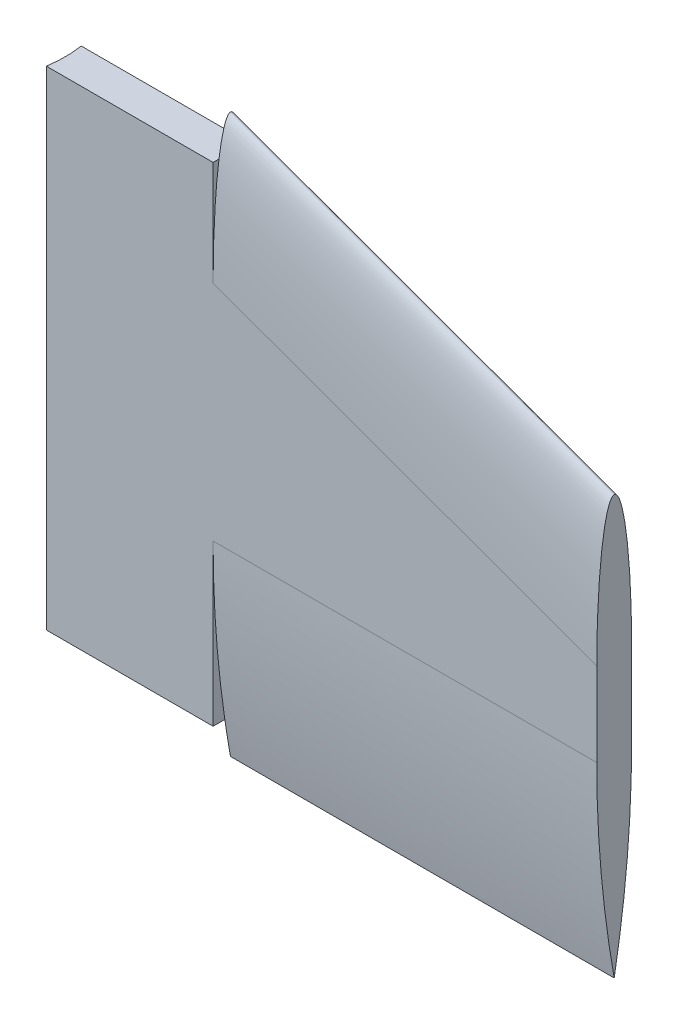
ISO-10303-21;
HEADER;
FILE_DESCRIPTION(('STEP AP214'),'2;1');
FILE_NAME('part.step','',(''),(''),'','','');
FILE_SCHEMA(('AUTOMOTIVE_DESIGN { 1 0 10303 214 1 1 1 1 }'));
ENDSEC;
DATA;
#1=APPLICATION_CONTEXT('core data for automotive mechanical design processes');
#2=APPLICATION_PROTOCOL_DEFINITION('international standard','automotive_design',2000,#1);
#3=PRODUCT_CONTEXT('',#1,'mechanical');
#4=PRODUCT('Part','Part','',(#3));
#5=PRODUCT_RELATED_PRODUCT_CATEGORY('part','',(#4));
#6=PRODUCT_DEFINITION_FORMATION('','',#4);
#7=PRODUCT_DEFINITION_CONTEXT('part definition',#1,'design');
#8=PRODUCT_DEFINITION('design','',#6,#7);
#9=PRODUCT_DEFINITION_SHAPE('','',#8);
#10=(LENGTH_UNIT() NAMED_UNIT(*) SI_UNIT(.MILLI.,.METRE.));
#11=(NAMED_UNIT(*) PLANE_ANGLE_UNIT() SI_UNIT($,.RADIAN.));
#12=(NAMED_UNIT(*) SI_UNIT($,.STERADIAN.) SOLID_ANGLE_UNIT());
#13=UNCERTAINTY_MEASURE_WITH_UNIT(LENGTH_MEASURE(1.E-05),#10,'distance_accuracy_value','');
#14=(GEOMETRIC_REPRESENTATION_CONTEXT(3) GLOBAL_UNCERTAINTY_ASSIGNED_CONTEXT((#13)) GLOBAL_UNIT_ASSIGNED_CONTEXT((#10,
#11,#12)) REPRESENTATION_CONTEXT('',''));
#15=CARTESIAN_POINT('',(0.,0.,0.));
#16=DIRECTION('',(0.,0.,1.));
#17=DIRECTION('',(1.,0.,0.));
#18=AXIS2_PLACEMENT_3D('',#15,#16,#17);
#19=CARTESIAN_POINT('',(80.,55.,5.));
#20=DIRECTION('',(-1.,0.,0.));
#21=DIRECTION('',(0.,-1.,0.));
#22=AXIS2_PLACEMENT_3D('',#19,#20,#21);
#23=PLANE('',#22);
#24=CARTESIAN_POINT('',(80.,23.,-153.05));
#25=DIRECTION('',(1.,0.,0.));
#26=DIRECTION('',(0.,1.,0.));
#27=AXIS2_PLACEMENT_3D('',#24,#25,#26);
#28=CIRCLE('',#27,158.05);
#29=CARTESIAN_POINT('',(80.,23.,5.));
#30=VERTEX_POINT('',#29);
#31=CARTESIAN_POINT('',(80.,-5.,2.5));
#32=VERTEX_POINT('',#31);
#33=EDGE_CURVE('E265',#30,#32,#28,.T.);
#34=ORIENTED_EDGE('',*,*,#33,.T.);
#35=CARTESIAN_POINT('',(80.,23.,158.05));
#36=DIRECTION('',(1.,0.,0.));
#37=DIRECTION('',(0.,1.,0.));
#38=AXIS2_PLACEMENT_3D('',#35,#36,#37);
#39=CIRCLE('',#38,158.05);
#40=CARTESIAN_POINT('',(80.,23.,0.));
#41=VERTEX_POINT('',#40);
#42=EDGE_CURVE('E161',#41,#32,#39,.F.);
#43=ORIENTED_EDGE('',*,*,#42,.F.);
#44=DIRECTION('',(0.,1.,0.));
#45=VECTOR('',#44,1.);
#46=CARTESIAN_POINT('',(80.,55.,0.));
#47=LINE('',#46,#45);
#48=CARTESIAN_POINT('',(80.,35.,0.));
#49=VERTEX_POINT('',#48);
#50=EDGE_CURVE('E170',#41,#49,#47,.T.);
#51=ORIENTED_EDGE('',*,*,#50,.T.);
#52=CARTESIAN_POINT('',(80.,35.,2.5));
#53=DIRECTION('',(1.,0.,0.));
#54=DIRECTION('',(0.,1.,0.));
#55=AXIS2_PLACEMENT_3D('',#52,#53,#54);
#56=ELLIPSE('',#55,20.,2.5);
#57=CARTESIAN_POINT('',(80.,35.,5.));
#58=VERTEX_POINT('',#57);
#59=EDGE_CURVE('E244',#49,#58,#56,.T.);
#60=ORIENTED_EDGE('',*,*,#59,.T.);
#61=DIRECTION('',(0.,1.,0.));
#62=VECTOR('',#61,1.);
#63=CARTESIAN_POINT('',(80.,55.,5.));
#64=LINE('',#63,#62);
#65=EDGE_CURVE('E174',#30,#58,#64,.T.);
#66=ORIENTED_EDGE('',*,*,#65,.F.);
#67=EDGE_LOOP('',(#34,#43,#51,#60,#66));
#68=FACE_BOUND('',#67,.T.);
#69=ADVANCED_FACE('F58',(#68),#23,.F.);
#70=CARTESIAN_POINT('',(25.,-5.,5.));
#71=DIRECTION('',(1.,0.,0.));
#72=DIRECTION('',(0.,1.,0.));
#73=AXIS2_PLACEMENT_3D('',#70,#71,#72);
#74=PLANE('',#73);
#75=DIRECTION('',(0.,0.,-1.));
#76=VECTOR('',#75,1.);
#77=CARTESIAN_POINT('',(25.,0.,5.));
#78=LINE('',#77,#76);
#79=CARTESIAN_POINT('',(25.,0.,3.31752380209902));
#80=VERTEX_POINT('',#79);
#81=CARTESIAN_POINT('',(25.,0.,1.68247619790099));
#82=VERTEX_POINT('',#81);
#83=EDGE_CURVE('E67',#80,#82,#78,.T.);
#84=ORIENTED_EDGE('',*,*,#83,.T.);
#85=CARTESIAN_POINT('',(25.,23.,158.05));
#86=DIRECTION('',(1.,0.,0.));
#87=DIRECTION('',(0.,1.,0.));
#88=AXIS2_PLACEMENT_3D('',#85,#86,#87);
#89=CIRCLE('',#88,158.05);
#90=CARTESIAN_POINT('',(24.9999999999996,-5.00000000000001,2.5));
#91=VERTEX_POINT('',#90);
#92=EDGE_CURVE('E275',#91,#82,#89,.T.);
#93=ORIENTED_EDGE('',*,*,#92,.F.);
#94=CARTESIAN_POINT('',(25.,23.,-153.05));
#95=DIRECTION('',(1.,0.,0.));
#96=DIRECTION('',(0.,1.,0.));
#97=AXIS2_PLACEMENT_3D('',#94,#95,#96);
#98=CIRCLE('',#97,158.05);
#99=EDGE_CURVE('E279',#91,#80,#98,.F.);
#100=ORIENTED_EDGE('',*,*,#99,.T.);
#101=EDGE_LOOP('',(#84,#93,#100));
#102=FACE_BOUND('',#101,.T.);
#103=ADVANCED_FACE('F295',(#102),#74,.F.);
#104=CARTESIAN_POINT('',(0.,0.,0.));
#105=DIRECTION('',(0.,0.,-1.));
#106=DIRECTION('',(-1.,0.,0.));
#107=AXIS2_PLACEMENT_3D('',#104,#105,#106);
#108=PLANE('',#107);
#109=DIRECTION('',(0.,1.,0.));
#110=VECTOR('',#109,1.);
#111=CARTESIAN_POINT('',(1.10222914111242,-5.,0.));
#112=LINE('',#111,#110);
#113=CARTESIAN_POINT('',(1.10222914111242,70.,0.));
#114=VERTEX_POINT('',#113);
#115=CARTESIAN_POINT('',(1.10222914111242,0.,0.));
#116=VERTEX_POINT('',#115);
#117=EDGE_CURVE('E143',#114,#116,#112,.F.);
#118=ORIENTED_EDGE('',*,*,#117,.F.);
#119=DIRECTION('',(-1.,0.,0.));
#120=VECTOR('',#119,1.);
#121=CARTESIAN_POINT('',(0.,70.,0.));
#122=LINE('',#121,#120);
#123=CARTESIAN_POINT('',(25.,70.,0.));
#124=VERTEX_POINT('',#123);
#125=EDGE_CURVE('E157',#124,#114,#122,.T.);
#126=ORIENTED_EDGE('',*,*,#125,.F.);
#127=DIRECTION('',(0.,-1.,0.));
#128=VECTOR('',#127,1.);
#129=CARTESIAN_POINT('',(24.9999999999999,27.1086884357356,0.));
#130=LINE('',#129,#128);
#131=CARTESIAN_POINT('',(25.,55.,0.));
#132=VERTEX_POINT('',#131);
#133=EDGE_CURVE('E235',#124,#132,#130,.T.);
#134=ORIENTED_EDGE('',*,*,#133,.T.);
#135=DIRECTION('',(0.939793423488437,-0.341743063086705,0.));
#136=VECTOR('',#135,1.);
#137=CARTESIAN_POINT('',(5.45110680172721,62.1086884357356,0.));
#138=LINE('',#137,#136);
#139=EDGE_CURVE('E236',#132,#49,#138,.T.);
#140=ORIENTED_EDGE('',*,*,#139,.T.);
#141=ORIENTED_EDGE('',*,*,#50,.F.);
#142=DIRECTION('',(1.,0.,0.));
#143=VECTOR('',#142,1.);
#144=CARTESIAN_POINT('',(-3.1113855937412,23.,0.));
#145=LINE('',#144,#143);
#146=CARTESIAN_POINT('',(25.,23.,0.));
#147=VERTEX_POINT('',#146);
#148=EDGE_CURVE('E421',#147,#41,#145,.T.);
#149=ORIENTED_EDGE('',*,*,#148,.F.);
#150=DIRECTION('',(0.,-1.,0.));
#151=VECTOR('',#150,1.);
#152=CARTESIAN_POINT('',(25.,0.,0.));
#153=LINE('',#152,#151);
#154=CARTESIAN_POINT('',(25.,0.,0.));
#155=VERTEX_POINT('',#154);
#156=EDGE_CURVE('E423',#147,#155,#153,.T.);
#157=ORIENTED_EDGE('',*,*,#156,.T.);
#158=DIRECTION('',(1.,0.,0.));
#159=VECTOR('',#158,1.);
#160=CARTESIAN_POINT('',(25.,0.,0.));
#161=LINE('',#160,#159);
#162=EDGE_CURVE('E159',#116,#155,#161,.T.);
#163=ORIENTED_EDGE('',*,*,#162,.F.);
#164=EDGE_LOOP('',(#118,#126,#134,#140,#141,#149,#157,#163));
#165=FACE_BOUND('',#164,.T.);
#166=ADVANCED_FACE('F155',(#165),#108,.T.);
#167=CARTESIAN_POINT('',(25.,70.,5.));
#168=DIRECTION('',(1.,0.,0.));
#169=DIRECTION('',(0.,1.,0.));
#170=AXIS2_PLACEMENT_3D('',#167,#168,#169);
#171=PLANE('',#170);
#172=CARTESIAN_POINT('',(25.,55.,5.));
#173=CARTESIAN_POINT('',(25.,55.5720004388794,4.99997488519982));
#174=CARTESIAN_POINT('',(25.,56.1440026961929,4.99693141602449));
#175=CARTESIAN_POINT('',(25.,57.2879536627687,4.98463095757736));
#176=CARTESIAN_POINT('',(25.,57.8599023704368,4.97537382074938));
#177=CARTESIAN_POINT('',(25.,59.0036644576572,4.95046914389847));
#178=CARTESIAN_POINT('',(25.,59.5754778365875,4.93482157505513));
#179=CARTESIAN_POINT('',(25.,60.718876444292,4.8967579252481));
#180=CARTESIAN_POINT('',(25.,61.2904616748311,4.87434189770684));
#181=CARTESIAN_POINT('',(25.,62.4333279929488,4.82216211654355));
#182=CARTESIAN_POINT('',(25.,63.0046090644194,4.79239800635157));
#183=CARTESIAN_POINT('',(25.,64.1466791661225,4.72464145556082));
#184=CARTESIAN_POINT('',(25.,64.7174682025077,4.68664911939574));
#185=CARTESIAN_POINT('',(25.,65.8584275394748,4.60111055722037));
#186=CARTESIAN_POINT('',(25.,66.4285977400708,4.55356296780029));
#187=CARTESIAN_POINT('',(25.,67.2830238536228,4.47346948162914));
#188=CARTESIAN_POINT('',(25.,67.5676927821684,4.44530981658055));
#189=CARTESIAN_POINT('',(25.,68.1366806467351,4.38566017037874));
#190=CARTESIAN_POINT('',(25.,68.4209995862596,4.35417022283987));
#191=CARTESIAN_POINT('',(25.,69.0618234563635,4.27880492355438));
#192=CARTESIAN_POINT('',(25.,69.4181992662102,4.23382139317496));
#193=CARTESIAN_POINT('',(25.,70.1299349019454,4.13633199524897));
#194=CARTESIAN_POINT('',(25.,70.485294742801,4.08382623910718));
#195=CARTESIAN_POINT('',(25.,71.079966111065,3.98738676032596));
#196=CARTESIAN_POINT('',(25.,71.3197146520282,3.94615594705027));
#197=CARTESIAN_POINT('',(25.,71.7981391093133,3.85788065785431));
#198=CARTESIAN_POINT('',(25.,72.0368151113112,3.81083665517478));
#199=CARTESIAN_POINT('',(25.,72.4363016405698,3.72523973527165));
#200=CARTESIAN_POINT('',(25.,72.597562391991,3.68879456718262));
#201=CARTESIAN_POINT('',(25.,72.9189981651543,3.61125273657672));
#202=CARTESIAN_POINT('',(25.,73.0791730823828,3.57015563285419));
#203=CARTESIAN_POINT('',(25.,73.3473629227435,3.49564855876825));
#204=CARTESIAN_POINT('',(25.,73.4558436171766,3.46392157541193));
#205=CARTESIAN_POINT('',(25.,73.671580658925,3.3966662266282));
#206=CARTESIAN_POINT('',(25.,73.7788375929399,3.36113977547955));
#207=CARTESIAN_POINT('',(25.,73.9584288067411,3.29674402046781));
#208=CARTESIAN_POINT('',(25.,74.0312493873934,3.26924081175468));
#209=CARTESIAN_POINT('',(25.,74.1756935186942,3.21099098100011));
#210=CARTESIAN_POINT('',(25.,74.2473155429742,3.18024054106987));
#211=CARTESIAN_POINT('',(25.,74.386176597405,3.11550565133564));
#212=CARTESIAN_POINT('',(25.,74.4534817890112,3.08166740579186));
#213=CARTESIAN_POINT('',(25.,74.5519053884584,3.02656378020559));
#214=CARTESIAN_POINT('',(25.,74.5842511685421,3.00749865373644));
#215=CARTESIAN_POINT('',(25.,74.6478256295048,2.96753460090541));
#216=CARTESIAN_POINT('',(25.,74.6790537975318,2.94663484747765));
#217=CARTESIAN_POINT('',(25.,74.7363257769538,2.90509397095348));
#218=CARTESIAN_POINT('',(25.,74.7625504448733,2.88470479128762));
#219=CARTESIAN_POINT('',(25.,74.8130750788164,2.84169326167559));
#220=CARTESIAN_POINT('',(25.,74.8373776803399,2.8190740686275));
#221=CARTESIAN_POINT('',(25.,74.8834528114579,2.770624493738));
#222=CARTESIAN_POINT('',(25.,74.9051780891119,2.74474811143269));
#223=CARTESIAN_POINT('',(25.,74.9436663388231,2.68951856317908));
#224=CARTESIAN_POINT('',(25.,74.9604529253396,2.66018291406145));
#225=CARTESIAN_POINT('',(25.,74.9817551484157,2.60870447367483));
#226=CARTESIAN_POINT('',(25.,74.9885022980104,2.58750611406828));
#227=CARTESIAN_POINT('',(25.,74.9976177941652,2.54420149170385));
#228=CARTESIAN_POINT('',(25.,74.999997694106,2.5220977830347));
#229=CARTESIAN_POINT('',(25.,75.0000020794715,2.48007206282373));
#230=CARTESIAN_POINT('',(25.,74.9980705662995,2.46014894470527));
#231=CARTESIAN_POINT('',(25.,74.9906222272486,2.42097290369096));
#232=CARTESIAN_POINT('',(25.,74.985099122873,2.40172121674289));
#233=CARTESIAN_POINT('',(25.,74.9690774229299,2.35895445753588));
#234=CARTESIAN_POINT('',(25.,74.9576029389327,2.33581237100939));
#235=CARTESIAN_POINT('',(25.,74.9311936192979,2.29161402067852));
#236=CARTESIAN_POINT('',(25.,74.9162512909001,2.2705624163366));
#237=CARTESIAN_POINT('',(25.,74.885292949687,2.23198707660667));
#238=CARTESIAN_POINT('',(25.,74.869456648164,2.21431593155002));
#239=CARTESIAN_POINT('',(25.,74.8363383138934,2.18037104962037));
#240=CARTESIAN_POINT('',(25.,74.8190549474168,2.16409863054509));
#241=CARTESIAN_POINT('',(25.,74.7833920798095,2.13271454405103));
#242=CARTESIAN_POINT('',(25.,74.7650097466571,2.11760612736233));
#243=CARTESIAN_POINT('',(25.,74.7274604629157,2.08842444650872));
#244=CARTESIAN_POINT('',(25.,74.7082938565375,2.07435073564678));
#245=CARTESIAN_POINT('',(25.,74.6554523949701,2.03734095975634));
#246=CARTESIAN_POINT('',(25.,74.6211868659335,2.01524941140818));
#247=CARTESIAN_POINT('',(25.,74.5514420908496,1.9730600143313));
#248=CARTESIAN_POINT('',(25.,74.5159621025146,1.95296341528778));
#249=CARTESIAN_POINT('',(25.,74.4081116333862,1.89498234461649));
#250=CARTESIAN_POINT('',(25.,74.3344586080401,1.85949070499232));
#251=CARTESIAN_POINT('',(25.,74.1849206859795,1.79272516176865));
#252=CARTESIAN_POINT('',(25.,74.1090271055556,1.76147133947762));
#253=CARTESIAN_POINT('',(25.,73.9560814934609,1.70226133138422));
#254=CARTESIAN_POINT('',(25.,73.8790310209192,1.67430109033174));
#255=CARTESIAN_POINT('',(25.,73.7097418409384,1.61595698386845));
#256=CARTESIAN_POINT('',(25.,73.6173296095386,1.58608123937837));
#257=CARTESIAN_POINT('',(25.,73.431660250649,1.52905988703803));
#258=CARTESIAN_POINT('',(25.,73.3384030048576,1.50191466810481));
#259=CARTESIAN_POINT('',(25.,73.1512033432352,1.44980621969121));
#260=CARTESIAN_POINT('',(25.,73.0572604358996,1.42484476586705));
#261=CARTESIAN_POINT('',(25.,72.8689058315822,1.37675177469865));
#262=CARTESIAN_POINT('',(25.,72.7744941143264,1.35362031723905));
#263=CARTESIAN_POINT('',(25.,72.491333736507,1.28668374573611));
#264=CARTESIAN_POINT('',(25.,72.3020432171087,1.24516932810004));
#265=CARTESIAN_POINT('',(25.,71.922594810639,1.16677471583677));
#266=CARTESIAN_POINT('',(25.,71.7324372744376,1.12989279382941));
#267=CARTESIAN_POINT('',(25.,71.352031468322,1.05991946495277));
#268=CARTESIAN_POINT('',(25.,71.1617852605057,1.02681679339588));
#269=CARTESIAN_POINT('',(25.,70.7807771762973,0.963634068583808));
#270=CARTESIAN_POINT('',(25.,70.5900152529589,0.933554300722833));
#271=CARTESIAN_POINT('',(25.,70.0170031948054,0.847114816925599));
#272=CARTESIAN_POINT('',(25.,69.6341750673416,0.79458135653289));
#273=CARTESIAN_POINT('',(25.,68.8676184858264,0.697285760413535));
#274=CARTESIAN_POINT('',(25.,68.4838901932427,0.652522325051148));
#275=CARTESIAN_POINT('',(25.,67.7157390510043,0.569293116986108));
#276=CARTESIAN_POINT('',(25.,67.3313161725483,0.53082761178575));
#277=CARTESIAN_POINT('',(25.,66.5620065337952,0.459206034539197));
#278=CARTESIAN_POINT('',(25.,66.1771198063282,0.426049606684746));
#279=CARTESIAN_POINT('',(25.,65.4069737301898,0.364350304300474));
#280=CARTESIAN_POINT('',(25.,65.0217143764718,0.335807493160882));
#281=CARTESIAN_POINT('',(25.,64.235704108839,0.281784251470453));
#282=CARTESIAN_POINT('',(25.,63.8349418790816,0.256469140801837));
#283=CARTESIAN_POINT('',(25.,63.0331824702211,0.209861020970679));
#284=CARTESIAN_POINT('',(25.,62.632185289196,0.188568045185991));
#285=CARTESIAN_POINT('',(25.,61.4289449335814,0.130233791579434));
#286=CARTESIAN_POINT('',(25.,60.6264293237784,0.0987356055028632));
#287=CARTESIAN_POINT('',(25.,59.0199991116043,0.0488384278155599));
#288=CARTESIAN_POINT('',(25.,58.2160840123997,0.0304558153104526));
#289=CARTESIAN_POINT('',(25.,57.0100971016644,0.0121447661575967));
#290=CARTESIAN_POINT('',(25.,56.6080906629853,0.00758489324828465));
#291=CARTESIAN_POINT('',(25.,55.80405657695,0.00151472190236802));
#292=CARTESIAN_POINT('',(25.,55.4020289297006,4.40933902144058E-06));
#293=CARTESIAN_POINT('',(25.,55.,0.));
#294=B_SPLINE_CURVE_WITH_KNOTS('',3,(#172,#173,#174,#175,#176,#177,#178,#179,#180,#181,#182,
#183,#184,#185,#186,#187,#188,#189,#190,#191,#192,#193,#194,#195,#196,#197,#198,#199,#200,#201,
#202,#203,#204,#205,#206,#207,#208,#209,#210,#211,#212,#213,#214,#215,#216,#217,#218,#219,#220,
#221,#222,#223,#224,#225,#226,#227,#228,#229,#230,#231,#232,#233,#234,#235,#236,#237,#238,#239,
#240,#241,#242,#243,#244,#245,#246,#247,#248,#249,#250,#251,#252,#253,#254,#255,#256,#257,#258,
#259,#260,#261,#262,#263,#264,#265,#266,#267,#268,#269,#270,#271,#272,#273,#274,#275,#276,#277,
#278,#279,#280,#281,#282,#283,#284,#285,#286,#287,#288,#289,#290,#291,#292,#293),.UNSPECIFIED.,
.F.,.F.,(4,2,2,2,2,2,2,2,2,2,2,2,2,2,2,2,2,2,2,2,2,2,2,2,2,2,2,2,2,2,2,2,2,2,2,2,2,2,2,2,2,2,2,
2,2,2,2,2,2,2,2,2,2,2,2,2,2,2,2,2,4),(0.,1.71599615077383,3.43203305280662,5.14807769412917,
6.86410879132182,8.58022317628934,10.2963157813946,12.0126534245768,12.8708127178165,
13.7289633500175,14.8065149463982,15.8840505858027,16.6138057869719,17.3435016192407,
17.8394387557629,18.3354229681512,18.6744504962385,19.0133080103136,19.2467739450679,
19.4805174966928,19.7062830459991,19.818878428791,19.9315248338326,20.0310866609772,
20.1305095146967,20.2315396252694,20.3320784999233,20.3984435996496,20.4646328787026,
20.5243228391227,20.5841174256887,20.6611680881807,20.7383868052756,20.8094685567982,
20.8806165596799,20.9519565524599,21.0232655636787,21.1454734386891,21.2677573909172,
21.5127827919942,21.758931466026,22.0047738273901,22.2960831250135,22.5874338561253,
22.879019329296,23.1706175240001,23.7518983265195,24.3329617315811,24.9122452799681,
25.4915834675965,26.6507115794247,27.8096456250835,28.968628883282,30.1275344352165,
31.2864559089432,32.491115962279,33.6957860120976,36.1050550965805,38.5173277041146,
39.7234145618279,40.9294958324678),.UNSPECIFIED.);
#295=CARTESIAN_POINT('',(25.,69.9999999999716,4.1535945694194));
#296=VERTEX_POINT('',#295);
#297=CARTESIAN_POINT('',(25.,70.,0.846405430584633));
#298=VERTEX_POINT('',#297);
#299=EDGE_CURVE('E196',#296,#298,#294,.T.);
#300=ORIENTED_EDGE('',*,*,#299,.T.);
#301=DIRECTION('',(0.,0.,-1.));
#302=VECTOR('',#301,1.);
#303=CARTESIAN_POINT('',(25.,70.,5.));
#304=LINE('',#303,#302);
#305=EDGE_CURVE('E179',#296,#298,#304,.T.);
#306=ORIENTED_EDGE('',*,*,#305,.F.);
#307=EDGE_LOOP('',(#300,#306));
#308=FACE_BOUND('',#307,.T.);
#309=ADVANCED_FACE('F316',(#308),#171,.F.);
#310=CARTESIAN_POINT('',(0.,0.,5.));
#311=DIRECTION('',(0.,0.,-1.));
#312=DIRECTION('',(-1.,0.,0.));
#313=AXIS2_PLACEMENT_3D('',#310,#311,#312);
#314=PLANE('',#313);
#315=DIRECTION('',(-1.,0.,0.));
#316=VECTOR('',#315,1.);
#317=CARTESIAN_POINT('',(0.,70.,5.));
#318=LINE('',#317,#316);
#319=CARTESIAN_POINT('',(25.,70.,5.));
#320=VERTEX_POINT('',#319);
#321=CARTESIAN_POINT('',(1.10222914111242,70.,5.));
#322=VERTEX_POINT('',#321);
#323=EDGE_CURVE('E183',#320,#322,#318,.T.);
#324=ORIENTED_EDGE('',*,*,#323,.T.);
#325=DIRECTION('',(0.,1.,0.));
#326=VECTOR('',#325,1.);
#327=CARTESIAN_POINT('',(1.10222914111242,-5.,5.));
#328=LINE('',#327,#326);
#329=CARTESIAN_POINT('',(1.10222914111242,0.,5.));
#330=VERTEX_POINT('',#329);
#331=EDGE_CURVE('E74',#322,#330,#328,.F.);
#332=ORIENTED_EDGE('',*,*,#331,.T.);
#333=DIRECTION('',(1.,0.,0.));
#334=VECTOR('',#333,1.);
#335=CARTESIAN_POINT('',(25.,0.,5.));
#336=LINE('',#335,#334);
#337=CARTESIAN_POINT('',(25.,0.,5.));
#338=VERTEX_POINT('',#337);
#339=EDGE_CURVE('E169',#330,#338,#336,.T.);
#340=ORIENTED_EDGE('',*,*,#339,.T.);
#341=DIRECTION('',(0.,1.,0.));
#342=VECTOR('',#341,1.);
#343=CARTESIAN_POINT('',(25.,0.,5.));
#344=LINE('',#343,#342);
#345=CARTESIAN_POINT('',(25.,23.,5.));
#346=VERTEX_POINT('',#345);
#347=EDGE_CURVE('E237',#338,#346,#344,.T.);
#348=ORIENTED_EDGE('',*,*,#347,.T.);
#349=DIRECTION('',(1.,0.,0.));
#350=VECTOR('',#349,1.);
#351=CARTESIAN_POINT('',(-3.1113855937412,23.,5.));
#352=LINE('',#351,#350);
#353=EDGE_CURVE('E262',#346,#30,#352,.T.);
#354=ORIENTED_EDGE('',*,*,#353,.T.);
#355=ORIENTED_EDGE('',*,*,#65,.T.);
#356=DIRECTION('',(0.939793423488437,-0.341743063086705,0.));
#357=VECTOR('',#356,1.);
#358=CARTESIAN_POINT('',(5.45110680172721,62.1086884357356,5.));
#359=LINE('',#358,#357);
#360=CARTESIAN_POINT('',(25.,55.,5.));
#361=VERTEX_POINT('',#360);
#362=EDGE_CURVE('E248',#361,#58,#359,.T.);
#363=ORIENTED_EDGE('',*,*,#362,.F.);
#364=DIRECTION('',(0.,1.,0.));
#365=VECTOR('',#364,1.);
#366=CARTESIAN_POINT('',(24.9999999999999,27.1086884357356,5.));
#367=LINE('',#366,#365);
#368=EDGE_CURVE('E199',#361,#320,#367,.T.);
#369=ORIENTED_EDGE('',*,*,#368,.T.);
#370=EDGE_LOOP('',(#324,#332,#340,#348,#354,#355,#363,#369));
#371=FACE_BOUND('',#370,.T.);
#372=ADVANCED_FACE('F258',(#371),#314,.F.);
#373=CARTESIAN_POINT('',(25.,0.,5.));
#374=DIRECTION('',(0.,1.,0.));
#375=DIRECTION('',(-1.,0.,0.));
#376=AXIS2_PLACEMENT_3D('',#373,#374,#375);
#377=PLANE('',#376);
#378=ORIENTED_EDGE('',*,*,#339,.F.);
#379=CARTESIAN_POINT('',(-14.6,0.,2.5));
#380=DIRECTION('',(0.,1.,0.));
#381=DIRECTION('',(-1.,0.,0.));
#382=AXIS2_PLACEMENT_3D('',#379,#380,#381);
#383=CIRCLE('',#382,15.9);
#384=EDGE_CURVE('E150',#330,#116,#383,.T.);
#385=ORIENTED_EDGE('',*,*,#384,.T.);
#386=ORIENTED_EDGE('',*,*,#162,.T.);
#387=DIRECTION('',(0.,0.,-1.));
#388=VECTOR('',#387,1.);
#389=CARTESIAN_POINT('',(25.,0.,5.));
#390=LINE('',#389,#388);
#391=EDGE_CURVE('E270',#82,#155,#390,.T.);
#392=ORIENTED_EDGE('',*,*,#391,.F.);
#393=ORIENTED_EDGE('',*,*,#83,.F.);
#394=EDGE_CURVE('E12',#338,#80,#78,.T.);
#395=ORIENTED_EDGE('',*,*,#394,.F.);
#396=EDGE_LOOP('',(#378,#385,#386,#392,#393,#395));
#397=FACE_BOUND('',#396,.T.);
#398=ADVANCED_FACE('F60',(#397),#377,.F.);
#399=CARTESIAN_POINT('',(0.,70.,5.));
#400=DIRECTION('',(0.,-1.,0.));
#401=DIRECTION('',(0.,0.,-1.));
#402=AXIS2_PLACEMENT_3D('',#399,#400,#401);
#403=PLANE('',#402);
#404=ORIENTED_EDGE('',*,*,#125,.T.);
#405=CARTESIAN_POINT('',(-14.6,70.,2.5));
#406=DIRECTION('',(0.,1.,0.));
#407=DIRECTION('',(0.,0.,1.));
#408=AXIS2_PLACEMENT_3D('',#405,#406,#407);
#409=CIRCLE('',#408,15.9);
#410=EDGE_CURVE('E140',#322,#114,#409,.T.);
#411=ORIENTED_EDGE('',*,*,#410,.F.);
#412=ORIENTED_EDGE('',*,*,#323,.F.);
#413=EDGE_CURVE('E82',#320,#296,#304,.T.);
#414=ORIENTED_EDGE('',*,*,#413,.T.);
#415=ORIENTED_EDGE('',*,*,#305,.T.);
#416=DIRECTION('',(0.,0.,1.));
#417=VECTOR('',#416,1.);
#418=CARTESIAN_POINT('',(25.,70.,5.));
#419=LINE('',#418,#417);
#420=EDGE_CURVE('E167',#124,#298,#419,.T.);
#421=ORIENTED_EDGE('',*,*,#420,.F.);
#422=EDGE_LOOP('',(#404,#411,#412,#414,#415,#421));
#423=FACE_BOUND('',#422,.T.);
#424=ADVANCED_FACE('F164',(#423),#403,.F.);
#425=CARTESIAN_POINT('',(25.,70.,5.));
#426=DIRECTION('',(1.,0.,0.));
#427=DIRECTION('',(0.,1.,0.));
#428=AXIS2_PLACEMENT_3D('',#425,#426,#427);
#429=PLANE('',#428);
#430=ORIENTED_EDGE('',*,*,#413,.F.);
#431=ORIENTED_EDGE('',*,*,#368,.F.);
#432=EDGE_CURVE('E191',#361,#296,#294,.T.);
#433=ORIENTED_EDGE('',*,*,#432,.T.);
#434=EDGE_LOOP('',(#430,#431,#433));
#435=FACE_BOUND('',#434,.T.);
#436=ADVANCED_FACE('F214',(#435),#429,.T.);
#437=CARTESIAN_POINT('',(5.45110680172721,62.1086884357356,2.5));
#438=DIRECTION('',(1.,0.,0.));
#439=DIRECTION('',(0.,1.,0.));
#440=AXIS2_PLACEMENT_3D('',#437,#438,#439);
#441=ELLIPSE('',#440,20.,2.5);
#442=DIRECTION('',(0.939793423488437,-0.341743063086705,0.));
#443=VECTOR('',#442,1.);
#444=SURFACE_OF_LINEAR_EXTRUSION('',#441,#443);
#445=ORIENTED_EDGE('',*,*,#362,.T.);
#446=ORIENTED_EDGE('',*,*,#59,.F.);
#447=ORIENTED_EDGE('',*,*,#139,.F.);
#448=CARTESIAN_POINT('',(25.,75.,2.5));
#449=CARTESIAN_POINT('',(25.,75.0000042136937,2.48994343839511));
#450=CARTESIAN_POINT('',(25.,74.9995141910002,2.47989326776371));
#451=CARTESIAN_POINT('',(25.,74.9975857623276,2.45989935032554));
#452=CARTESIAN_POINT('',(25.,74.9961488072463,2.4499554643184));
#453=CARTESIAN_POINT('',(25.,74.9905313792137,2.42067013736418));
#454=CARTESIAN_POINT('',(25.,74.9850417372372,2.40157199550245));
#455=CARTESIAN_POINT('',(25.,74.9690968549742,2.35900119575021));
#456=CARTESIAN_POINT('',(25.,74.9576520231023,2.33591004196755));
#457=CARTESIAN_POINT('',(25.,74.9312575404135,2.29170539509219));
#458=CARTESIAN_POINT('',(25.,74.9162857098476,2.27060565232271));
#459=CARTESIAN_POINT('',(25.,74.8852846858752,2.23197645918265));
#460=CARTESIAN_POINT('',(25.,74.8694391074506,2.21429626208947));
#461=CARTESIAN_POINT('',(25.,74.8363008612856,2.18033435755991));
#462=CARTESIAN_POINT('',(25.,74.8190068585861,2.16405396890938));
#463=CARTESIAN_POINT('',(25.,74.7833416135611,2.13267248556184));
#464=CARTESIAN_POINT('',(25.,74.7649686999294,2.11757330976966));
#465=CARTESIAN_POINT('',(25.,74.727439265385,2.08840888962179));
#466=CARTESIAN_POINT('',(25.,74.7082830899833,2.07434319687569));
#467=CARTESIAN_POINT('',(25.,74.6554561931707,2.03734361648175));
#468=CARTESIAN_POINT('',(25.,74.6211946616423,2.01525444121563));
#469=CARTESIAN_POINT('',(25.,74.5514581076329,1.97306939117668));
#470=CARTESIAN_POINT('',(25.,74.5159823432048,1.95297476549188));
#471=CARTESIAN_POINT('',(25.,74.4081446681199,1.89499915372032));
#472=CARTESIAN_POINT('',(25.,74.3345004038152,1.85951058449887));
#473=CARTESIAN_POINT('',(25.,74.1849633408187,1.79274299632428));
#474=CARTESIAN_POINT('',(25.,74.1090614291252,1.76148505048995));
#475=CARTESIAN_POINT('',(25.,73.9560988533404,1.70226762980694));
#476=CARTESIAN_POINT('',(25.,73.8790397489879,1.67430409814561));
#477=CARTESIAN_POINT('',(25.,73.7097406515254,1.61595657423429));
#478=CARTESIAN_POINT('',(25.,73.6173272157849,1.58608046512519));
#479=CARTESIAN_POINT('',(25.,73.4316554302632,1.52905844563794));
#480=CARTESIAN_POINT('',(25.,73.3383969621777,1.50191292418623));
#481=CARTESIAN_POINT('',(25.,73.1511948451099,1.44980391609908));
#482=CARTESIAN_POINT('',(25.,73.0572507046213,1.42484220513031));
#483=CARTESIAN_POINT('',(25.,72.868893626651,1.37674873419254));
#484=CARTESIAN_POINT('',(25.,72.7744806688949,1.35361705410989));
#485=CARTESIAN_POINT('',(25.,72.4913214623977,1.28668101438657));
#486=CARTESIAN_POINT('',(25.,72.3020333847468,1.245167233723));
#487=CARTESIAN_POINT('',(25.,71.9225898807083,1.1667737599413));
#488=CARTESIAN_POINT('',(25.,71.7324348051398,1.12989233969223));
#489=CARTESIAN_POINT('',(25.,71.3520315132265,1.05991947313782));
#490=CARTESIAN_POINT('',(25.,71.1617853503989,1.02681680902172));
#491=CARTESIAN_POINT('',(25.,70.780777385095,0.963634102492492));
#492=CARTESIAN_POINT('',(25.,70.5900155357474,0.933554345017586));
#493=CARTESIAN_POINT('',(25.,70.0170034332904,0.847114849604889));
#494=CARTESIAN_POINT('',(25.,69.6341751868888,0.794581371791309));
#495=CARTESIAN_POINT('',(25.,68.8676183139808,0.697285738517141));
#496=CARTESIAN_POINT('',(25.,68.4838898488105,0.652522284479512));
#497=CARTESIAN_POINT('',(25.,67.7157391958449,0.569293135931237));
#498=CARTESIAN_POINT('',(25.,67.3313169807185,0.530827695266689));
#499=CARTESIAN_POINT('',(25.,66.5620036140953,0.45920575448629));
#500=CARTESIAN_POINT('',(25.,66.1771124890043,0.426048968191966));
#501=CARTESIAN_POINT('',(25.,65.4069659341628,0.364349731980911));
#502=CARTESIAN_POINT('',(25.,65.0217105072748,0.33580724610636));
#503=CARTESIAN_POINT('',(25.,64.2357124983412,0.281784808465017));
#504=CARTESIAN_POINT('',(25.,63.8349585991276,0.256470121897294));
#505=CARTESIAN_POINT('',(25.,63.0332159553546,0.209862958555296));
#506=CARTESIAN_POINT('',(25.,62.6322272086561,0.188570519006163));
#507=CARTESIAN_POINT('',(25.,61.4289768947993,0.130234456960134));
#508=CARTESIAN_POINT('',(25.,60.6264401935414,0.0987326897176284));
#509=CARTESIAN_POINT('',(25.,59.4218514773483,0.0613219550742259));
#510=CARTESIAN_POINT('',(25.,59.0199410354448,0.0504883591537324));
#511=CARTESIAN_POINT('',(25.,58.2160558066156,0.032004094955054));
#512=CARTESIAN_POINT('',(25.,57.8140810216463,0.0243533434907717));
#513=CARTESIAN_POINT('',(25.,57.0101010564617,0.0121435033771766));
#514=CARTESIAN_POINT('',(25.,56.6080958780718,0.00758429273120171));
#515=CARTESIAN_POINT('',(25.,55.8040604474983,0.00151539104280885));
#516=CARTESIAN_POINT('',(25.,55.4020301951997,5.7151933546876E-06));
#517=CARTESIAN_POINT('',(25.,55.,0.));
#518=B_SPLINE_CURVE_WITH_KNOTS('',3,(#448,#449,#450,#451,#452,#453,#454,#455,#456,#457,#458,
#459,#460,#461,#462,#463,#464,#465,#466,#467,#468,#469,#470,#471,#472,#473,#474,#475,#476,#477,
#478,#479,#480,#481,#482,#483,#484,#485,#486,#487,#488,#489,#490,#491,#492,#493,#494,#495,#496,
#497,#498,#499,#500,#501,#502,#503,#504,#505,#506,#507,#508,#509,#510,#511,#512,#513,#514,#515,
#516,#517),.UNSPECIFIED.,.F.,.F.,(4,2,2,2,2,2,2,2,2,2,2,2,2,2,2,2,2,2,2,2,2,2,2,2,2,2,2,2,2,2,2,
2,2,2,4),(0.,0.0301462662504388,0.0602464492004564,0.119552097942786,0.196438351270844,
0.273821661519294,0.344942737677006,0.416130100468274,0.487430805498409,0.55870039082881,
0.680894362120765,0.803164380945513,1.04816216220671,1.29433860431914,1.54020865866258,
1.83152172904954,2.12287623352253,2.41446547965439,2.70606744751692,3.28734069019321,
3.8683965633269,4.44767997488133,5.02701793839212,6.18614641115364,7.34508097589567,
8.5040622408616,9.66298100651581,10.8218907406382,12.0265254574017,13.2311713222872,
15.6404899269291,16.8466507886558,18.0527801244564,19.2588618618826,20.464949608065),.UNSPECIFIED.);
#519=EDGE_CURVE('E227',#298,#132,#518,.T.);
#520=ORIENTED_EDGE('',*,*,#519,.F.);
#521=ORIENTED_EDGE('',*,*,#299,.F.);
#522=ORIENTED_EDGE('',*,*,#432,.F.);
#523=EDGE_LOOP('',(#445,#446,#447,#520,#521,#522));
#524=FACE_BOUND('',#523,.T.);
#525=ADVANCED_FACE('F211',(#524),#444,.T.);
#526=CARTESIAN_POINT('',(25.,70.,5.));
#527=DIRECTION('',(1.,0.,0.));
#528=DIRECTION('',(0.,1.,0.));
#529=AXIS2_PLACEMENT_3D('',#526,#527,#528);
#530=PLANE('',#529);
#531=ORIENTED_EDGE('',*,*,#420,.T.);
#532=ORIENTED_EDGE('',*,*,#519,.T.);
#533=ORIENTED_EDGE('',*,*,#133,.F.);
#534=EDGE_LOOP('',(#531,#532,#533));
#535=FACE_BOUND('',#534,.T.);
#536=ADVANCED_FACE('F218',(#535),#530,.T.);
#537=CARTESIAN_POINT('',(25.,-5.,5.));
#538=DIRECTION('',(1.,0.,0.));
#539=DIRECTION('',(0.,1.,0.));
#540=AXIS2_PLACEMENT_3D('',#537,#538,#539);
#541=PLANE('',#540);
#542=ORIENTED_EDGE('',*,*,#394,.T.);
#543=EDGE_CURVE('E281',#80,#346,#98,.F.);
#544=ORIENTED_EDGE('',*,*,#543,.T.);
#545=ORIENTED_EDGE('',*,*,#347,.F.);
#546=EDGE_LOOP('',(#542,#544,#545));
#547=FACE_BOUND('',#546,.T.);
#548=ADVANCED_FACE('F222',(#547),#541,.T.);
#549=CARTESIAN_POINT('',(-3.1113855937412,23.,-153.05));
#550=DIRECTION('',(1.,0.,0.));
#551=DIRECTION('',(0.,1.,0.));
#552=AXIS2_PLACEMENT_3D('',#549,#550,#551);
#553=CYLINDRICAL_SURFACE('',#552,158.05);
#554=DIRECTION('',(1.,0.,0.));
#555=VECTOR('',#554,1.);
#556=CARTESIAN_POINT('',(-3.11138559374119,-5.00000000000002,2.5));
#557=LINE('',#556,#555);
#558=EDGE_CURVE('E274',#91,#32,#557,.T.);
#559=ORIENTED_EDGE('',*,*,#558,.T.);
#560=ORIENTED_EDGE('',*,*,#33,.F.);
#561=ORIENTED_EDGE('',*,*,#353,.F.);
#562=ORIENTED_EDGE('',*,*,#543,.F.);
#563=ORIENTED_EDGE('',*,*,#99,.F.);
#564=EDGE_LOOP('',(#559,#560,#561,#562,#563));
#565=FACE_BOUND('',#564,.T.);
#566=ADVANCED_FACE('F224',(#565),#553,.T.);
#567=CARTESIAN_POINT('',(25.,-5.,5.));
#568=DIRECTION('',(1.,0.,0.));
#569=DIRECTION('',(0.,1.,0.));
#570=AXIS2_PLACEMENT_3D('',#567,#568,#569);
#571=PLANE('',#570);
#572=ORIENTED_EDGE('',*,*,#391,.T.);
#573=ORIENTED_EDGE('',*,*,#156,.F.);
#574=EDGE_CURVE('E299',#82,#147,#89,.T.);
#575=ORIENTED_EDGE('',*,*,#574,.F.);
#576=EDGE_LOOP('',(#572,#573,#575));
#577=FACE_BOUND('',#576,.T.);
#578=ADVANCED_FACE('F302',(#577),#571,.T.);
#579=CARTESIAN_POINT('',(-3.1113855937412,23.,158.05));
#580=DIRECTION('',(1.,0.,0.));
#581=DIRECTION('',(0.,1.,0.));
#582=AXIS2_PLACEMENT_3D('',#579,#580,#581);
#583=CYLINDRICAL_SURFACE('',#582,158.05);
#584=ORIENTED_EDGE('',*,*,#92,.T.);
#585=ORIENTED_EDGE('',*,*,#574,.T.);
#586=ORIENTED_EDGE('',*,*,#148,.T.);
#587=ORIENTED_EDGE('',*,*,#42,.T.);
#588=ORIENTED_EDGE('',*,*,#558,.F.);
#589=EDGE_LOOP('',(#584,#585,#586,#587,#588));
#590=FACE_BOUND('',#589,.T.);
#591=ADVANCED_FACE('F307',(#590),#583,.T.);
#592=CARTESIAN_POINT('',(-14.6,-5.,2.5));
#593=DIRECTION('',(0.,1.,0.));
#594=DIRECTION('',(0.,0.,1.));
#595=AXIS2_PLACEMENT_3D('',#592,#593,#594);
#596=CYLINDRICAL_SURFACE('',#595,15.9);
#597=ORIENTED_EDGE('',*,*,#117,.T.);
#598=ORIENTED_EDGE('',*,*,#384,.F.);
#599=ORIENTED_EDGE('',*,*,#331,.F.);
#600=ORIENTED_EDGE('',*,*,#410,.T.);
#601=EDGE_LOOP('',(#597,#598,#599,#600));
#602=FACE_BOUND('',#601,.T.);
#603=ADVANCED_FACE('F142',(#602),#596,.F.);
#604=CLOSED_SHELL('',(#69,#103,#166,#309,#372,#398,#424,#436,#525,#536,#548,#566,#578,#591,#603));
#605=MANIFOLD_SOLID_BREP('B2',#604);
#606=ADVANCED_BREP_SHAPE_REPRESENTATION('',(#18,#605),#14);
#607=SHAPE_DEFINITION_REPRESENTATION(#9,#606);
ENDSEC;
END-ISO-10303-21;
